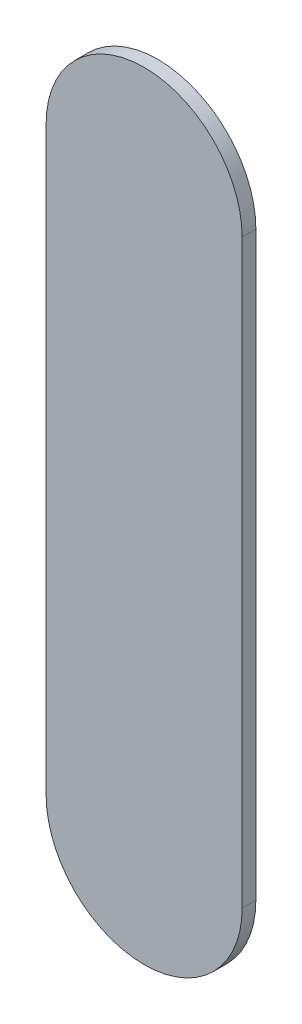
ISO-10303-21;
HEADER;
FILE_DESCRIPTION(('STEP AP214'),'2;1');
FILE_NAME('part.step','',(''),(''),'','','');
FILE_SCHEMA(('AUTOMOTIVE_DESIGN { 1 0 10303 214 1 1 1 1 }'));
ENDSEC;
DATA;
#1=APPLICATION_CONTEXT('core data for automotive mechanical design processes');
#2=APPLICATION_PROTOCOL_DEFINITION('international standard','automotive_design',2000,#1);
#3=PRODUCT_CONTEXT('',#1,'mechanical');
#4=PRODUCT('Part','Part','',(#3));
#5=PRODUCT_RELATED_PRODUCT_CATEGORY('part','',(#4));
#6=PRODUCT_DEFINITION_FORMATION('','',#4);
#7=PRODUCT_DEFINITION_CONTEXT('part definition',#1,'design');
#8=PRODUCT_DEFINITION('design','',#6,#7);
#9=PRODUCT_DEFINITION_SHAPE('','',#8);
#10=(LENGTH_UNIT() NAMED_UNIT(*) SI_UNIT(.MILLI.,.METRE.));
#11=(NAMED_UNIT(*) PLANE_ANGLE_UNIT() SI_UNIT($,.RADIAN.));
#12=(NAMED_UNIT(*) SI_UNIT($,.STERADIAN.) SOLID_ANGLE_UNIT());
#13=UNCERTAINTY_MEASURE_WITH_UNIT(LENGTH_MEASURE(1.E-05),#10,'distance_accuracy_value','');
#14=(GEOMETRIC_REPRESENTATION_CONTEXT(3) GLOBAL_UNCERTAINTY_ASSIGNED_CONTEXT((#13)) GLOBAL_UNIT_ASSIGNED_CONTEXT((#10,
#11,#12)) REPRESENTATION_CONTEXT('',''));
#15=CARTESIAN_POINT('',(0.,0.,0.));
#16=DIRECTION('',(0.,0.,1.));
#17=DIRECTION('',(1.,0.,0.));
#18=AXIS2_PLACEMENT_3D('',#15,#16,#17);
#19=CARTESIAN_POINT('',(109.629,-121.284,1.635));
#20=DIRECTION('',(0.,0.,1.));
#21=DIRECTION('',(1.,0.,0.));
#22=AXIS2_PLACEMENT_3D('',#19,#20,#21);
#23=PLANE('',#22);
#24=DIRECTION('',(0.,-1.,0.));
#25=VECTOR('',#24,1.);
#26=CARTESIAN_POINT('',(109.629,-121.284,1.635));
#27=LINE('',#26,#25);
#28=CARTESIAN_POINT('',(109.629,-121.284,1.635));
#29=VERTEX_POINT('',#28);
#30=CARTESIAN_POINT('',(109.629,-122.7665,1.635));
#31=VERTEX_POINT('',#30);
#32=EDGE_CURVE('E90',#29,#31,#27,.T.);
#33=ORIENTED_EDGE('',*,*,#32,.T.);
#34=CARTESIAN_POINT('',(109.879,-122.7665,1.635));
#35=DIRECTION('',(0.,0.,1.));
#36=DIRECTION('',(-1.,0.,0.));
#37=AXIS2_PLACEMENT_3D('',#34,#35,#36);
#38=CIRCLE('',#37,0.25);
#39=CARTESIAN_POINT('',(110.129,-122.7665,1.635));
#40=VERTEX_POINT('',#39);
#41=EDGE_CURVE('E85',#31,#40,#38,.T.);
#42=ORIENTED_EDGE('',*,*,#41,.T.);
#43=DIRECTION('',(0.,1.,0.));
#44=VECTOR('',#43,1.);
#45=CARTESIAN_POINT('',(110.129,-122.7665,1.635));
#46=LINE('',#45,#44);
#47=CARTESIAN_POINT('',(110.129,-121.284,1.635));
#48=VERTEX_POINT('',#47);
#49=EDGE_CURVE('E112',#40,#48,#46,.T.);
#50=ORIENTED_EDGE('',*,*,#49,.T.);
#51=CARTESIAN_POINT('',(109.879,-121.284,1.635));
#52=DIRECTION('',(0.,0.,1.));
#53=DIRECTION('',(1.,0.,0.));
#54=AXIS2_PLACEMENT_3D('',#51,#52,#53);
#55=CIRCLE('',#54,0.25);
#56=EDGE_CURVE('E11',#48,#29,#55,.T.);
#57=ORIENTED_EDGE('',*,*,#56,.T.);
#58=EDGE_LOOP('',(#33,#42,#50,#57));
#59=FACE_BOUND('',#58,.T.);
#60=ADVANCED_FACE('F17',(#59),#23,.T.);
#61=CARTESIAN_POINT('',(109.629,-121.284,1.6));
#62=DIRECTION('',(0.,0.,1.));
#63=DIRECTION('',(1.,0.,0.));
#64=AXIS2_PLACEMENT_3D('',#61,#62,#63);
#65=PLANE('',#64);
#66=CARTESIAN_POINT('',(109.879,-121.284,1.6));
#67=DIRECTION('',(0.,0.,1.));
#68=DIRECTION('',(1.,0.,0.));
#69=AXIS2_PLACEMENT_3D('',#66,#67,#68);
#70=CIRCLE('',#69,0.25);
#71=CARTESIAN_POINT('',(110.129,-121.284,1.6));
#72=VERTEX_POINT('',#71);
#73=CARTESIAN_POINT('',(109.629,-121.284,1.6));
#74=VERTEX_POINT('',#73);
#75=EDGE_CURVE('E25',#72,#74,#70,.T.);
#76=ORIENTED_EDGE('',*,*,#75,.F.);
#77=DIRECTION('',(0.,1.,0.));
#78=VECTOR('',#77,1.);
#79=CARTESIAN_POINT('',(110.129,-122.7665,1.6));
#80=LINE('',#79,#78);
#81=CARTESIAN_POINT('',(110.129,-122.7665,1.6));
#82=VERTEX_POINT('',#81);
#83=EDGE_CURVE('E73',#82,#72,#80,.T.);
#84=ORIENTED_EDGE('',*,*,#83,.F.);
#85=CARTESIAN_POINT('',(109.879,-122.7665,1.6));
#86=DIRECTION('',(0.,0.,1.));
#87=DIRECTION('',(-1.,0.,0.));
#88=AXIS2_PLACEMENT_3D('',#85,#86,#87);
#89=CIRCLE('',#88,0.25);
#90=CARTESIAN_POINT('',(109.629,-122.7665,1.6));
#91=VERTEX_POINT('',#90);
#92=EDGE_CURVE('E67',#91,#82,#89,.T.);
#93=ORIENTED_EDGE('',*,*,#92,.F.);
#94=DIRECTION('',(0.,-1.,0.));
#95=VECTOR('',#94,1.);
#96=CARTESIAN_POINT('',(109.629,-121.284,1.6));
#97=LINE('',#96,#95);
#98=EDGE_CURVE('E71',#74,#91,#97,.T.);
#99=ORIENTED_EDGE('',*,*,#98,.F.);
#100=EDGE_LOOP('',(#76,#84,#93,#99));
#101=FACE_BOUND('',#100,.T.);
#102=ADVANCED_FACE('F69',(#101),#65,.F.);
#103=CARTESIAN_POINT('',(109.879,-121.284,1.6));
#104=DIRECTION('',(0.,0.,-1.));
#105=DIRECTION('',(1.,0.,0.));
#106=AXIS2_PLACEMENT_3D('',#103,#104,#105);
#107=CYLINDRICAL_SURFACE('',#106,0.25);
#108=ORIENTED_EDGE('',*,*,#75,.T.);
#109=DIRECTION('',(0.,0.,1.));
#110=VECTOR('',#109,1.);
#111=CARTESIAN_POINT('',(109.629,-121.284,1.6));
#112=LINE('',#111,#110);
#113=EDGE_CURVE('E79',#74,#29,#112,.T.);
#114=ORIENTED_EDGE('',*,*,#113,.T.);
#115=ORIENTED_EDGE('',*,*,#56,.F.);
#116=DIRECTION('',(0.,0.,1.));
#117=VECTOR('',#116,1.);
#118=CARTESIAN_POINT('',(110.129,-121.284,1.6));
#119=LINE('',#118,#117);
#120=EDGE_CURVE('E100',#72,#48,#119,.T.);
#121=ORIENTED_EDGE('',*,*,#120,.F.);
#122=EDGE_LOOP('',(#108,#114,#115,#121));
#123=FACE_BOUND('',#122,.T.);
#124=ADVANCED_FACE('F117',(#123),#107,.T.);
#125=CARTESIAN_POINT('',(110.129,-122.7665,1.6));
#126=DIRECTION('',(-1.,0.,0.));
#127=DIRECTION('',(0.,0.,1.));
#128=AXIS2_PLACEMENT_3D('',#125,#126,#127);
#129=PLANE('',#128);
#130=ORIENTED_EDGE('',*,*,#83,.T.);
#131=ORIENTED_EDGE('',*,*,#120,.T.);
#132=ORIENTED_EDGE('',*,*,#49,.F.);
#133=DIRECTION('',(0.,0.,1.));
#134=VECTOR('',#133,1.);
#135=CARTESIAN_POINT('',(110.129,-122.7665,1.6));
#136=LINE('',#135,#134);
#137=EDGE_CURVE('E78',#82,#40,#136,.T.);
#138=ORIENTED_EDGE('',*,*,#137,.F.);
#139=EDGE_LOOP('',(#130,#131,#132,#138));
#140=FACE_BOUND('',#139,.T.);
#141=ADVANCED_FACE('F121',(#140),#129,.F.);
#142=CARTESIAN_POINT('',(109.879,-122.7665,1.6));
#143=DIRECTION('',(0.,0.,-1.));
#144=DIRECTION('',(-1.,0.,0.));
#145=AXIS2_PLACEMENT_3D('',#142,#143,#144);
#146=CYLINDRICAL_SURFACE('',#145,0.25);
#147=ORIENTED_EDGE('',*,*,#92,.T.);
#148=ORIENTED_EDGE('',*,*,#137,.T.);
#149=ORIENTED_EDGE('',*,*,#41,.F.);
#150=DIRECTION('',(0.,0.,1.));
#151=VECTOR('',#150,1.);
#152=CARTESIAN_POINT('',(109.629,-122.7665,1.6));
#153=LINE('',#152,#151);
#154=EDGE_CURVE('E82',#91,#31,#153,.T.);
#155=ORIENTED_EDGE('',*,*,#154,.F.);
#156=EDGE_LOOP('',(#147,#148,#149,#155));
#157=FACE_BOUND('',#156,.T.);
#158=ADVANCED_FACE('F83',(#157),#146,.T.);
#159=CARTESIAN_POINT('',(109.629,-121.284,1.6));
#160=DIRECTION('',(1.,0.,0.));
#161=DIRECTION('',(0.,1.,0.));
#162=AXIS2_PLACEMENT_3D('',#159,#160,#161);
#163=PLANE('',#162);
#164=ORIENTED_EDGE('',*,*,#98,.T.);
#165=ORIENTED_EDGE('',*,*,#154,.T.);
#166=ORIENTED_EDGE('',*,*,#32,.F.);
#167=ORIENTED_EDGE('',*,*,#113,.F.);
#168=EDGE_LOOP('',(#164,#165,#166,#167));
#169=FACE_BOUND('',#168,.T.);
#170=ADVANCED_FACE('F93',(#169),#163,.F.);
#171=CLOSED_SHELL('',(#60,#102,#124,#141,#158,#170));
#172=MANIFOLD_SOLID_BREP('B1',#171);
#173=ADVANCED_BREP_SHAPE_REPRESENTATION('',(#18,#172),#14);
#174=SHAPE_DEFINITION_REPRESENTATION(#9,#173);
ENDSEC;
END-ISO-10303-21;
